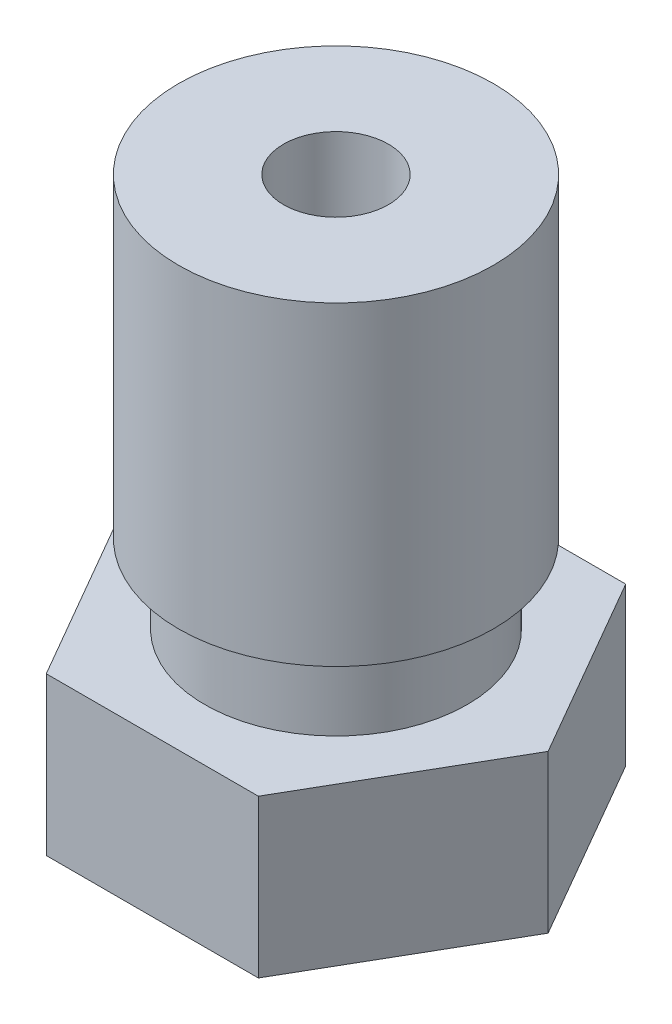
ISO-10303-21;
HEADER;
FILE_DESCRIPTION(('STEP AP214'),'2;1');
FILE_NAME('part.step','',(''),(''),'','','');
FILE_SCHEMA(('AUTOMOTIVE_DESIGN { 1 0 10303 214 1 1 1 1 }'));
ENDSEC;
DATA;
#1=APPLICATION_CONTEXT('core data for automotive mechanical design processes');
#2=APPLICATION_PROTOCOL_DEFINITION('international standard','automotive_design',2000,#1);
#3=PRODUCT_CONTEXT('',#1,'mechanical');
#4=PRODUCT('Part','Part','',(#3));
#5=PRODUCT_RELATED_PRODUCT_CATEGORY('part','',(#4));
#6=PRODUCT_DEFINITION_FORMATION('','',#4);
#7=PRODUCT_DEFINITION_CONTEXT('part definition',#1,'design');
#8=PRODUCT_DEFINITION('design','',#6,#7);
#9=PRODUCT_DEFINITION_SHAPE('','',#8);
#10=(LENGTH_UNIT() NAMED_UNIT(*) SI_UNIT(.MILLI.,.METRE.));
#11=(NAMED_UNIT(*) PLANE_ANGLE_UNIT() SI_UNIT($,.RADIAN.));
#12=(NAMED_UNIT(*) SI_UNIT($,.STERADIAN.) SOLID_ANGLE_UNIT());
#13=UNCERTAINTY_MEASURE_WITH_UNIT(LENGTH_MEASURE(1.E-05),#10,'distance_accuracy_value','');
#14=(GEOMETRIC_REPRESENTATION_CONTEXT(3) GLOBAL_UNCERTAINTY_ASSIGNED_CONTEXT((#13)) GLOBAL_UNIT_ASSIGNED_CONTEXT((#10,
#11,#12)) REPRESENTATION_CONTEXT('',''));
#15=CARTESIAN_POINT('',(0.,0.,0.));
#16=DIRECTION('',(0.,0.,1.));
#17=DIRECTION('',(1.,0.,0.));
#18=AXIS2_PLACEMENT_3D('',#15,#16,#17);
#19=CARTESIAN_POINT('',(0.,0.774677267864659,0.));
#20=DIRECTION('',(0.,1.,0.));
#21=DIRECTION('',(-1.,0.,0.));
#22=AXIS2_PLACEMENT_3D('',#19,#20,#21);
#23=CONICAL_SURFACE('',#22,0.375,1.02974425867665);
#24=CARTESIAN_POINT('',(0.,0.699569690486214,0.));
#25=DIRECTION('',(0.,1.,0.));
#26=DIRECTION('',(-1.,0.,0.));
#27=AXIS2_PLACEMENT_3D('',#24,#25,#26);
#28=CIRCLE('',#27,0.25);
#29=CARTESIAN_POINT('',(0.25,0.699569690486214,0.));
#30=VERTEX_POINT('',#29);
#31=EDGE_CURVE('E27',#30,#30,#28,.T.);
#32=ORIENTED_EDGE('',*,*,#31,.F.);
#33=EDGE_LOOP('',(#32));
#34=FACE_BOUND('',#33,.T.);
#35=CARTESIAN_POINT('',(0.,1.,0.));
#36=DIRECTION('',(0.,1.,0.));
#37=DIRECTION('',(-1.,0.,0.));
#38=AXIS2_PLACEMENT_3D('',#35,#36,#37);
#39=CIRCLE('',#38,0.75);
#40=CARTESIAN_POINT('',(-0.75,1.,0.));
#41=VERTEX_POINT('',#40);
#42=EDGE_CURVE('E11',#41,#41,#39,.T.);
#43=ORIENTED_EDGE('',*,*,#42,.T.);
#44=EDGE_LOOP('',(#43));
#45=FACE_BOUND('',#44,.T.);
#46=ADVANCED_FACE('F17',(#34,#45),#23,.F.);
#47=CARTESIAN_POINT('',(0.,6.75,0.));
#48=DIRECTION('',(0.,1.,0.));
#49=DIRECTION('',(-1.,0.,0.));
#50=AXIS2_PLACEMENT_3D('',#47,#48,#49);
#51=CYLINDRICAL_SURFACE('',#50,0.75);
#52=CARTESIAN_POINT('',(0.,1.8497848452431,0.));
#53=DIRECTION('',(0.,-1.,0.));
#54=DIRECTION('',(-1.,0.,0.));
#55=AXIS2_PLACEMENT_3D('',#52,#53,#54);
#56=CIRCLE('',#55,0.75);
#57=CARTESIAN_POINT('',(0.75,1.8497848452431,0.));
#58=VERTEX_POINT('',#57);
#59=EDGE_CURVE('E113',#58,#58,#56,.T.);
#60=ORIENTED_EDGE('',*,*,#59,.F.);
#61=EDGE_LOOP('',(#60));
#62=FACE_BOUND('',#61,.T.);
#63=ORIENTED_EDGE('',*,*,#42,.F.);
#64=EDGE_LOOP('',(#63));
#65=FACE_BOUND('',#64,.T.);
#66=ADVANCED_FACE('F198',(#62,#65),#51,.F.);
#67=CARTESIAN_POINT('',(0.,-3.94941741622887,0.));
#68=DIRECTION('',(0.,1.,0.));
#69=DIRECTION('',(-1.,0.,0.));
#70=AXIS2_PLACEMENT_3D('',#67,#68,#69);
#71=CYLINDRICAL_SURFACE('',#70,0.25);
#72=ORIENTED_EDGE('',*,*,#31,.T.);
#73=EDGE_LOOP('',(#72));
#74=FACE_BOUND('',#73,.T.);
#75=CARTESIAN_POINT('',(0.,0.,0.));
#76=DIRECTION('',(0.,1.,0.));
#77=DIRECTION('',(-1.,0.,0.));
#78=AXIS2_PLACEMENT_3D('',#75,#76,#77);
#79=CIRCLE('',#78,0.25);
#80=CARTESIAN_POINT('',(0.25,0.,0.));
#81=VERTEX_POINT('',#80);
#82=EDGE_CURVE('E106',#81,#81,#79,.T.);
#83=ORIENTED_EDGE('',*,*,#82,.F.);
#84=EDGE_LOOP('',(#83));
#85=FACE_BOUND('',#84,.T.);
#86=ADVANCED_FACE('F203',(#74,#85),#71,.F.);
#87=CARTESIAN_POINT('',(0.,1.69956969048621,0.));
#88=DIRECTION('',(0.,1.,0.));
#89=DIRECTION('',(-1.,0.,0.));
#90=AXIS2_PLACEMENT_3D('',#87,#88,#89);
#91=CONICAL_SURFACE('',#90,0.5,1.02974425867665);
#92=ORIENTED_EDGE('',*,*,#59,.T.);
#93=EDGE_LOOP('',(#92));
#94=FACE_BOUND('',#93,.T.);
#95=CARTESIAN_POINT('',(0.,2.,0.));
#96=DIRECTION('',(0.,1.,0.));
#97=DIRECTION('',(-1.,0.,0.));
#98=AXIS2_PLACEMENT_3D('',#95,#96,#97);
#99=CIRCLE('',#98,1.);
#100=CARTESIAN_POINT('',(-1.,2.,0.));
#101=VERTEX_POINT('',#100);
#102=EDGE_CURVE('E114',#101,#101,#99,.T.);
#103=ORIENTED_EDGE('',*,*,#102,.T.);
#104=EDGE_LOOP('',(#103));
#105=FACE_BOUND('',#104,.T.);
#106=ADVANCED_FACE('F210',(#94,#105),#91,.F.);
#107=CARTESIAN_POINT('',(0.,7.25,0.));
#108=DIRECTION('',(0.,1.,0.));
#109=DIRECTION('',(-1.,0.,0.));
#110=AXIS2_PLACEMENT_3D('',#107,#108,#109);
#111=CYLINDRICAL_SURFACE('',#110,1.);
#112=CARTESIAN_POINT('',(0.,12.5,0.));
#113=DIRECTION('',(0.,-1.,0.));
#114=DIRECTION('',(-1.,0.,0.));
#115=AXIS2_PLACEMENT_3D('',#112,#113,#114);
#116=CIRCLE('',#115,1.);
#117=CARTESIAN_POINT('',(-1.00000000000001,12.5,0.));
#118=VERTEX_POINT('',#117);
#119=EDGE_CURVE('E118',#118,#118,#116,.T.);
#120=ORIENTED_EDGE('',*,*,#119,.F.);
#121=EDGE_LOOP('',(#120));
#122=FACE_BOUND('',#121,.T.);
#123=ORIENTED_EDGE('',*,*,#102,.F.);
#124=EDGE_LOOP('',(#123));
#125=FACE_BOUND('',#124,.T.);
#126=ADVANCED_FACE('F214',(#122,#125),#111,.F.);
#127=CARTESIAN_POINT('',(2.02072594216369,2.,-3.5));
#128=DIRECTION('',(0.,0.,-1.));
#129=DIRECTION('',(0.707106781186548,0.707106781186548,0.));
#130=AXIS2_PLACEMENT_3D('',#127,#128,#129);
#131=PLANE('',#130);
#132=DIRECTION('',(-1.,0.,0.));
#133=VECTOR('',#132,1.);
#134=CARTESIAN_POINT('',(4.51036297108184,5.,-3.5));
#135=LINE('',#134,#133);
#136=CARTESIAN_POINT('',(2.02072594216368,5.,-3.5));
#137=VERTEX_POINT('',#136);
#138=CARTESIAN_POINT('',(-2.02072594216369,5.,-3.5));
#139=VERTEX_POINT('',#138);
#140=EDGE_CURVE('E123',#137,#139,#135,.T.);
#141=ORIENTED_EDGE('',*,*,#140,.F.);
#142=DIRECTION('',(0.,1.,0.));
#143=VECTOR('',#142,1.);
#144=CARTESIAN_POINT('',(2.02072594216369,2.,-3.5));
#145=LINE('',#144,#143);
#146=CARTESIAN_POINT('',(2.02072594216369,2.,-3.5));
#147=VERTEX_POINT('',#146);
#148=EDGE_CURVE('E127',#147,#137,#145,.T.);
#149=ORIENTED_EDGE('',*,*,#148,.F.);
#150=DIRECTION('',(1.,0.,0.));
#151=VECTOR('',#150,1.);
#152=CARTESIAN_POINT('',(1.96057050929156,2.,-3.5));
#153=LINE('',#152,#151);
#154=CARTESIAN_POINT('',(-2.02072594216369,2.,-3.5));
#155=VERTEX_POINT('',#154);
#156=EDGE_CURVE('E131',#155,#147,#153,.T.);
#157=ORIENTED_EDGE('',*,*,#156,.F.);
#158=DIRECTION('',(0.,1.,0.));
#159=VECTOR('',#158,1.);
#160=CARTESIAN_POINT('',(-2.02072594216369,2.,-3.5));
#161=LINE('',#160,#159);
#162=EDGE_CURVE('E117',#155,#139,#161,.T.);
#163=ORIENTED_EDGE('',*,*,#162,.T.);
#164=EDGE_LOOP('',(#141,#149,#157,#163));
#165=FACE_BOUND('',#164,.T.);
#166=ADVANCED_FACE('F218',(#165),#131,.T.);
#167=CARTESIAN_POINT('',(-2.02072594216369,2.,-3.5));
#168=DIRECTION('',(-0.866025403784439,0.,-0.5));
#169=DIRECTION('',(-0.377964473009228,0.654653670707977,0.654653670707977));
#170=AXIS2_PLACEMENT_3D('',#167,#168,#169);
#171=PLANE('',#170);
#172=DIRECTION('',(-0.5,0.,0.866025403784439));
#173=VECTOR('',#172,1.);
#174=CARTESIAN_POINT('',(-1.65090742770462,5.,-4.14054445662277));
#175=LINE('',#174,#173);
#176=CARTESIAN_POINT('',(-4.04145188432739,5.,0.));
#177=VERTEX_POINT('',#176);
#178=EDGE_CURVE('E126',#139,#177,#175,.T.);
#179=ORIENTED_EDGE('',*,*,#178,.F.);
#180=ORIENTED_EDGE('',*,*,#162,.F.);
#181=DIRECTION('',(0.5,0.,-0.866025403784439));
#182=VECTOR('',#181,1.);
#183=CARTESIAN_POINT('',(-2.28835554315219,2.,-3.03645193347855));
#184=LINE('',#183,#182);
#185=CARTESIAN_POINT('',(-4.04145188432738,2.,0.));
#186=VERTEX_POINT('',#185);
#187=EDGE_CURVE('E133',#186,#155,#184,.T.);
#188=ORIENTED_EDGE('',*,*,#187,.F.);
#189=DIRECTION('',(0.,1.,0.));
#190=VECTOR('',#189,1.);
#191=CARTESIAN_POINT('',(-4.04145188432738,2.,0.));
#192=LINE('',#191,#190);
#193=EDGE_CURVE('E137',#186,#177,#192,.T.);
#194=ORIENTED_EDGE('',*,*,#193,.T.);
#195=EDGE_LOOP('',(#179,#180,#188,#194));
#196=FACE_BOUND('',#195,.T.);
#197=ADVANCED_FACE('F222',(#196),#171,.T.);
#198=CARTESIAN_POINT('',(-4.04145188432738,2.,0.));
#199=DIRECTION('',(-0.866025403784439,0.,0.5));
#200=DIRECTION('',(0.377964473009227,0.654653670707977,0.654653670707977));
#201=AXIS2_PLACEMENT_3D('',#198,#199,#200);
#202=PLANE('',#201);
#203=DIRECTION('',(0.5,0.,0.866025403784439));
#204=VECTOR('',#203,1.);
#205=CARTESIAN_POINT('',(-2.66127039878647,5.,2.39054445662277));
#206=LINE('',#205,#204);
#207=CARTESIAN_POINT('',(-2.0207259421637,5.,3.5));
#208=VERTEX_POINT('',#207);
#209=EDGE_CURVE('E139',#177,#208,#206,.T.);
#210=ORIENTED_EDGE('',*,*,#209,.F.);
#211=ORIENTED_EDGE('',*,*,#193,.F.);
#212=DIRECTION('',(-0.5,0.,-0.866025403784439));
#213=VECTOR('',#212,1.);
#214=CARTESIAN_POINT('',(-3.29871851423403,2.,1.28645193347854));
#215=LINE('',#214,#213);
#216=CARTESIAN_POINT('',(-2.02072594216369,2.,3.5));
#217=VERTEX_POINT('',#216);
#218=EDGE_CURVE('E142',#217,#186,#215,.T.);
#219=ORIENTED_EDGE('',*,*,#218,.F.);
#220=DIRECTION('',(0.,1.,0.));
#221=VECTOR('',#220,1.);
#222=CARTESIAN_POINT('',(-2.02072594216369,2.,3.5));
#223=LINE('',#222,#221);
#224=EDGE_CURVE('E145',#217,#208,#223,.T.);
#225=ORIENTED_EDGE('',*,*,#224,.T.);
#226=EDGE_LOOP('',(#210,#211,#219,#225));
#227=FACE_BOUND('',#226,.T.);
#228=ADVANCED_FACE('F226',(#227),#202,.T.);
#229=CARTESIAN_POINT('',(-2.02072594216369,2.,3.5));
#230=DIRECTION('',(0.,0.,1.));
#231=DIRECTION('',(0.707106781186548,0.707106781186548,0.));
#232=AXIS2_PLACEMENT_3D('',#229,#230,#231);
#233=PLANE('',#232);
#234=DIRECTION('',(1.,0.,0.));
#235=VECTOR('',#234,1.);
#236=CARTESIAN_POINT('',(2.48963702891815,5.,3.5));
#237=LINE('',#236,#235);
#238=CARTESIAN_POINT('',(2.02072594216368,5.,3.5));
#239=VERTEX_POINT('',#238);
#240=EDGE_CURVE('E153',#208,#239,#237,.T.);
#241=ORIENTED_EDGE('',*,*,#240,.F.);
#242=ORIENTED_EDGE('',*,*,#224,.F.);
#243=DIRECTION('',(-1.,0.,0.));
#244=VECTOR('',#243,1.);
#245=CARTESIAN_POINT('',(-0.0601554328721369,2.,3.5));
#246=LINE('',#245,#244);
#247=CARTESIAN_POINT('',(2.02072594216369,2.,3.5));
#248=VERTEX_POINT('',#247);
#249=EDGE_CURVE('E150',#248,#217,#246,.T.);
#250=ORIENTED_EDGE('',*,*,#249,.F.);
#251=DIRECTION('',(0.,1.,0.));
#252=VECTOR('',#251,1.);
#253=CARTESIAN_POINT('',(2.02072594216369,2.,3.5));
#254=LINE('',#253,#252);
#255=EDGE_CURVE('E130',#248,#239,#254,.T.);
#256=ORIENTED_EDGE('',*,*,#255,.T.);
#257=EDGE_LOOP('',(#241,#242,#250,#256));
#258=FACE_BOUND('',#257,.T.);
#259=ADVANCED_FACE('F230',(#258),#233,.T.);
#260=CARTESIAN_POINT('',(4.04145188432738,2.,0.));
#261=DIRECTION('',(0.866025403784438,0.,-0.5));
#262=DIRECTION('',(0.377964473009227,0.654653670707977,0.654653670707977));
#263=AXIS2_PLACEMENT_3D('',#260,#261,#262);
#264=PLANE('',#263);
#265=DIRECTION('',(-0.5,0.,-0.866025403784438));
#266=VECTOR('',#265,1.);
#267=CARTESIAN_POINT('',(4.41127039878646,5.,0.640544456622767));
#268=LINE('',#267,#266);
#269=CARTESIAN_POINT('',(4.04145188432738,5.,0.));
#270=VERTEX_POINT('',#269);
#271=EDGE_CURVE('E125',#270,#137,#268,.T.);
#272=ORIENTED_EDGE('',*,*,#271,.F.);
#273=DIRECTION('',(0.,1.,0.));
#274=VECTOR('',#273,1.);
#275=CARTESIAN_POINT('',(4.04145188432738,2.,0.));
#276=LINE('',#275,#274);
#277=CARTESIAN_POINT('',(4.04145188432738,2.,0.));
#278=VERTEX_POINT('',#277);
#279=EDGE_CURVE('E121',#278,#270,#276,.T.);
#280=ORIENTED_EDGE('',*,*,#279,.F.);
#281=DIRECTION('',(0.5,0.,0.866025403784438));
#282=VECTOR('',#281,1.);
#283=CARTESIAN_POINT('',(3.77382228333889,2.,-0.46354806652146));
#284=LINE('',#283,#282);
#285=EDGE_CURVE('E134',#147,#278,#284,.T.);
#286=ORIENTED_EDGE('',*,*,#285,.F.);
#287=ORIENTED_EDGE('',*,*,#148,.T.);
#288=EDGE_LOOP('',(#272,#280,#286,#287));
#289=FACE_BOUND('',#288,.T.);
#290=ADVANCED_FACE('F234',(#289),#264,.T.);
#291=CARTESIAN_POINT('',(2.02072594216369,2.,3.5));
#292=DIRECTION('',(0.866025403784439,0.,0.5));
#293=DIRECTION('',(-0.377964473009228,0.654653670707977,0.654653670707977));
#294=AXIS2_PLACEMENT_3D('',#291,#292,#293);
#295=PLANE('',#294);
#296=DIRECTION('',(0.5,0.,-0.866025403784439));
#297=VECTOR('',#296,1.);
#298=CARTESIAN_POINT('',(3.40090742770461,5.,1.10945554337723));
#299=LINE('',#298,#297);
#300=EDGE_CURVE('E156',#239,#270,#299,.T.);
#301=ORIENTED_EDGE('',*,*,#300,.F.);
#302=ORIENTED_EDGE('',*,*,#255,.F.);
#303=DIRECTION('',(-0.5,0.,0.866025403784439));
#304=VECTOR('',#303,1.);
#305=CARTESIAN_POINT('',(2.76345931225704,2.,2.21354806652146));
#306=LINE('',#305,#304);
#307=EDGE_CURVE('E110',#278,#248,#306,.T.);
#308=ORIENTED_EDGE('',*,*,#307,.F.);
#309=ORIENTED_EDGE('',*,*,#279,.T.);
#310=EDGE_LOOP('',(#301,#302,#308,#309));
#311=FACE_BOUND('',#310,.T.);
#312=ADVANCED_FACE('F238',(#311),#295,.T.);
#313=CARTESIAN_POINT('',(3.,12.5,0.));
#314=DIRECTION('',(0.,1.,0.));
#315=DIRECTION('',(0.707106781186548,0.,0.707106781186548));
#316=AXIS2_PLACEMENT_3D('',#313,#314,#315);
#317=PLANE('',#316);
#318=ORIENTED_EDGE('',*,*,#119,.T.);
#319=EDGE_LOOP('',(#318));
#320=FACE_BOUND('',#319,.T.);
#321=CARTESIAN_POINT('',(0.,12.5,0.));
#322=DIRECTION('',(0.,-1.,0.));
#323=DIRECTION('',(1.,0.,0.));
#324=AXIS2_PLACEMENT_3D('',#321,#322,#323);
#325=CIRCLE('',#324,3.);
#326=CARTESIAN_POINT('',(3.,12.5,0.));
#327=VERTEX_POINT('',#326);
#328=EDGE_CURVE('E122',#327,#327,#325,.T.);
#329=ORIENTED_EDGE('',*,*,#328,.F.);
#330=EDGE_LOOP('',(#329));
#331=FACE_BOUND('',#330,.T.);
#332=ADVANCED_FACE('F242',(#320,#331),#317,.T.);
#333=CARTESIAN_POINT('',(0.,9.5,0.));
#334=DIRECTION('',(0.,-1.,0.));
#335=DIRECTION('',(1.,0.,0.));
#336=AXIS2_PLACEMENT_3D('',#333,#334,#335);
#337=CYLINDRICAL_SURFACE('',#336,3.);
#338=ORIENTED_EDGE('',*,*,#328,.T.);
#339=EDGE_LOOP('',(#338));
#340=FACE_BOUND('',#339,.T.);
#341=CARTESIAN_POINT('',(0.,6.5,0.));
#342=DIRECTION('',(0.,-1.,0.));
#343=DIRECTION('',(1.,0.,0.));
#344=AXIS2_PLACEMENT_3D('',#341,#342,#343);
#345=CIRCLE('',#344,3.);
#346=CARTESIAN_POINT('',(3.,6.5,0.));
#347=VERTEX_POINT('',#346);
#348=EDGE_CURVE('E172',#347,#347,#345,.T.);
#349=ORIENTED_EDGE('',*,*,#348,.F.);
#350=EDGE_LOOP('',(#349));
#351=FACE_BOUND('',#350,.T.);
#352=ADVANCED_FACE('F194',(#340,#351),#337,.T.);
#353=CARTESIAN_POINT('',(2.5,6.5,0.));
#354=DIRECTION('',(0.,-1.,0.));
#355=DIRECTION('',(0.707106781186548,0.,0.707106781186548));
#356=AXIS2_PLACEMENT_3D('',#353,#354,#355);
#357=PLANE('',#356);
#358=ORIENTED_EDGE('',*,*,#348,.T.);
#359=EDGE_LOOP('',(#358));
#360=FACE_BOUND('',#359,.T.);
#361=CARTESIAN_POINT('',(0.,6.5,0.));
#362=DIRECTION('',(0.,-1.,0.));
#363=DIRECTION('',(1.,0.,0.));
#364=AXIS2_PLACEMENT_3D('',#361,#362,#363);
#365=CIRCLE('',#364,2.5);
#366=CARTESIAN_POINT('',(2.5,6.5,0.));
#367=VERTEX_POINT('',#366);
#368=EDGE_CURVE('E155',#367,#367,#365,.T.);
#369=ORIENTED_EDGE('',*,*,#368,.F.);
#370=EDGE_LOOP('',(#369));
#371=FACE_BOUND('',#370,.T.);
#372=ADVANCED_FACE('F183',(#360,#371),#357,.T.);
#373=CARTESIAN_POINT('',(0.,5.75,0.));
#374=DIRECTION('',(0.,-1.,0.));
#375=DIRECTION('',(1.,0.,0.));
#376=AXIS2_PLACEMENT_3D('',#373,#374,#375);
#377=CYLINDRICAL_SURFACE('',#376,2.5);
#378=ORIENTED_EDGE('',*,*,#368,.T.);
#379=EDGE_LOOP('',(#378));
#380=FACE_BOUND('',#379,.T.);
#381=CARTESIAN_POINT('',(0.,5.,0.));
#382=DIRECTION('',(0.,-1.,0.));
#383=DIRECTION('',(1.,0.,0.));
#384=AXIS2_PLACEMENT_3D('',#381,#382,#383);
#385=CIRCLE('',#384,2.5);
#386=CARTESIAN_POINT('',(2.5,5.,0.));
#387=VERTEX_POINT('',#386);
#388=EDGE_CURVE('E147',#387,#387,#385,.T.);
#389=ORIENTED_EDGE('',*,*,#388,.F.);
#390=EDGE_LOOP('',(#389));
#391=FACE_BOUND('',#390,.T.);
#392=ADVANCED_FACE('F181',(#380,#391),#377,.T.);
#393=CARTESIAN_POINT('',(7.,5.,0.));
#394=DIRECTION('',(0.,1.,0.));
#395=DIRECTION('',(0.707106781186548,0.,0.707106781186548));
#396=AXIS2_PLACEMENT_3D('',#393,#394,#395);
#397=PLANE('',#396);
#398=ORIENTED_EDGE('',*,*,#240,.T.);
#399=ORIENTED_EDGE('',*,*,#300,.T.);
#400=ORIENTED_EDGE('',*,*,#271,.T.);
#401=ORIENTED_EDGE('',*,*,#140,.T.);
#402=ORIENTED_EDGE('',*,*,#178,.T.);
#403=ORIENTED_EDGE('',*,*,#209,.T.);
#404=EDGE_LOOP('',(#398,#399,#400,#401,#402,#403));
#405=FACE_BOUND('',#404,.T.);
#406=ORIENTED_EDGE('',*,*,#388,.T.);
#407=EDGE_LOOP('',(#406));
#408=FACE_BOUND('',#407,.T.);
#409=ADVANCED_FACE('F179',(#405,#408),#397,.T.);
#410=CARTESIAN_POINT('',(1.90041507641942,2.,0.));
#411=DIRECTION('',(0.,-1.,0.));
#412=DIRECTION('',(0.707106781186548,0.,0.707106781186548));
#413=AXIS2_PLACEMENT_3D('',#410,#411,#412);
#414=PLANE('',#413);
#415=ORIENTED_EDGE('',*,*,#249,.T.);
#416=ORIENTED_EDGE('',*,*,#218,.T.);
#417=ORIENTED_EDGE('',*,*,#187,.T.);
#418=ORIENTED_EDGE('',*,*,#156,.T.);
#419=ORIENTED_EDGE('',*,*,#285,.T.);
#420=ORIENTED_EDGE('',*,*,#307,.T.);
#421=EDGE_LOOP('',(#415,#416,#417,#418,#419,#420));
#422=FACE_BOUND('',#421,.T.);
#423=CARTESIAN_POINT('',(0.,2.,0.));
#424=DIRECTION('',(0.,-1.,0.));
#425=DIRECTION('',(1.,0.,0.));
#426=AXIS2_PLACEMENT_3D('',#423,#424,#425);
#427=CIRCLE('',#426,1.90041507641942);
#428=CARTESIAN_POINT('',(1.90041507641942,2.,0.));
#429=VERTEX_POINT('',#428);
#430=EDGE_CURVE('E100',#429,#429,#427,.T.);
#431=ORIENTED_EDGE('',*,*,#430,.F.);
#432=EDGE_LOOP('',(#431));
#433=FACE_BOUND('',#432,.T.);
#434=ADVANCED_FACE('F191',(#422,#433),#414,.T.);
#435=CARTESIAN_POINT('',(0.,1.,0.));
#436=DIRECTION('',(0.,1.,0.));
#437=DIRECTION('',(1.,0.,0.));
#438=AXIS2_PLACEMENT_3D('',#435,#436,#437);
#439=CONICAL_SURFACE('',#438,1.20020753820971,0.610865238198017);
#440=ORIENTED_EDGE('',*,*,#430,.T.);
#441=EDGE_LOOP('',(#440));
#442=FACE_BOUND('',#441,.T.);
#443=CARTESIAN_POINT('',(0.,0.,0.));
#444=DIRECTION('',(0.,-1.,0.));
#445=DIRECTION('',(1.,0.,0.));
#446=AXIS2_PLACEMENT_3D('',#443,#444,#445);
#447=CIRCLE('',#446,0.5);
#448=CARTESIAN_POINT('',(0.5,0.,0.));
#449=VERTEX_POINT('',#448);
#450=EDGE_CURVE('E21',#449,#449,#447,.T.);
#451=ORIENTED_EDGE('',*,*,#450,.F.);
#452=EDGE_LOOP('',(#451));
#453=FACE_BOUND('',#452,.T.);
#454=ADVANCED_FACE('F104',(#442,#453),#439,.T.);
#455=CARTESIAN_POINT('',(0.,0.,0.));
#456=DIRECTION('',(0.,-1.,0.));
#457=DIRECTION('',(0.707106781186548,0.,0.707106781186548));
#458=AXIS2_PLACEMENT_3D('',#455,#456,#457);
#459=PLANE('',#458);
#460=ORIENTED_EDGE('',*,*,#82,.T.);
#461=EDGE_LOOP('',(#460));
#462=FACE_BOUND('',#461,.T.);
#463=ORIENTED_EDGE('',*,*,#450,.T.);
#464=EDGE_LOOP('',(#463));
#465=FACE_BOUND('',#464,.T.);
#466=ADVANCED_FACE('F19',(#462,#465),#459,.T.);
#467=CLOSED_SHELL('',(#46,#66,#86,#106,#126,#166,#197,#228,#259,#290,#312,#332,#352,#372,#392,
#409,#434,#454,#466));
#468=MANIFOLD_SOLID_BREP('B1',#467);
#469=ADVANCED_BREP_SHAPE_REPRESENTATION('',(#18,#468),#14);
#470=SHAPE_DEFINITION_REPRESENTATION(#9,#469);
ENDSEC;
END-ISO-10303-21;
